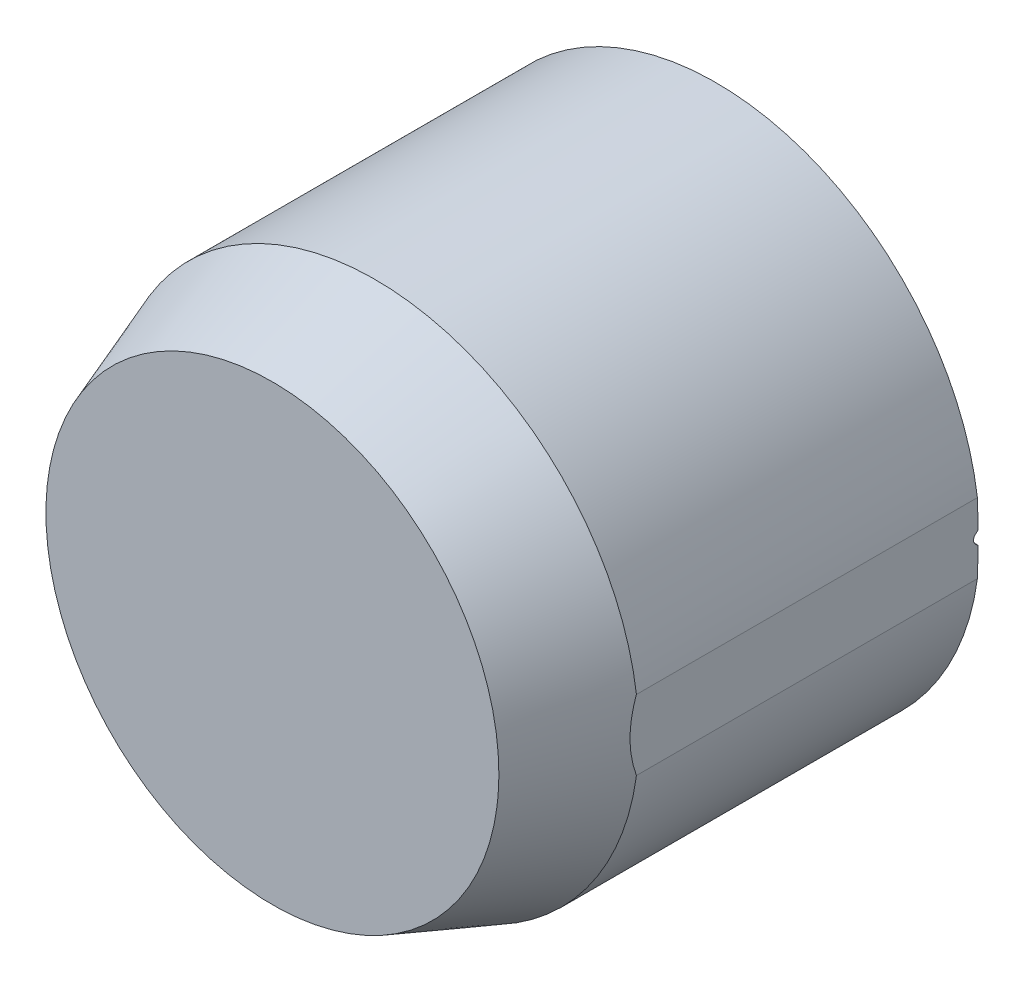
ISO-10303-21;
HEADER;
FILE_DESCRIPTION(('STEP AP214'),'2;1');
FILE_NAME('part.step','',(''),(''),'','','');
FILE_SCHEMA(('AUTOMOTIVE_DESIGN { 1 0 10303 214 1 1 1 1 }'));
ENDSEC;
DATA;
#1=APPLICATION_CONTEXT('core data for automotive mechanical design processes');
#2=APPLICATION_PROTOCOL_DEFINITION('international standard','automotive_design',2000,#1);
#3=PRODUCT_CONTEXT('',#1,'mechanical');
#4=PRODUCT('Part','Part','',(#3));
#5=PRODUCT_RELATED_PRODUCT_CATEGORY('part','',(#4));
#6=PRODUCT_DEFINITION_FORMATION('','',#4);
#7=PRODUCT_DEFINITION_CONTEXT('part definition',#1,'design');
#8=PRODUCT_DEFINITION('design','',#6,#7);
#9=PRODUCT_DEFINITION_SHAPE('','',#8);
#10=(LENGTH_UNIT() NAMED_UNIT(*) SI_UNIT(.MILLI.,.METRE.));
#11=(NAMED_UNIT(*) PLANE_ANGLE_UNIT() SI_UNIT($,.RADIAN.));
#12=(NAMED_UNIT(*) SI_UNIT($,.STERADIAN.) SOLID_ANGLE_UNIT());
#13=UNCERTAINTY_MEASURE_WITH_UNIT(LENGTH_MEASURE(1.E-05),#10,'distance_accuracy_value','');
#14=(GEOMETRIC_REPRESENTATION_CONTEXT(3) GLOBAL_UNCERTAINTY_ASSIGNED_CONTEXT((#13)) GLOBAL_UNIT_ASSIGNED_CONTEXT((#10,
#11,#12)) REPRESENTATION_CONTEXT('',''));
#15=CARTESIAN_POINT('',(0.,0.,0.));
#16=DIRECTION('',(0.,0.,1.));
#17=DIRECTION('',(1.,0.,0.));
#18=AXIS2_PLACEMENT_3D('',#15,#16,#17);
#19=CARTESIAN_POINT('',(0.,0.,-15.6));
#20=DIRECTION('',(0.,0.,1.));
#21=DIRECTION('',(1.,0.,0.));
#22=AXIS2_PLACEMENT_3D('',#19,#20,#21);
#23=CONICAL_SURFACE('',#22,7.25,1.30899693899575);
#24=CARTESIAN_POINT('',(0.,0.,-15.1310889132455));
#25=DIRECTION('',(0.,0.,1.));
#26=DIRECTION('',(1.,0.,0.));
#27=AXIS2_PLACEMENT_3D('',#24,#25,#26);
#28=CIRCLE('',#27,9.);
#29=CARTESIAN_POINT('',(-8.99769609071522,-0.20362971081845,-15.1310889132455));
#30=VERTEX_POINT('',#29);
#31=CARTESIAN_POINT('',(8.92,-1.19733036376764,-15.1310889132455));
#32=VERTEX_POINT('',#31);
#33=EDGE_CURVE('E136',#30,#32,#28,.T.);
#34=ORIENTED_EDGE('',*,*,#33,.F.);
#35=CARTESIAN_POINT('',(-8.99844651612489,-0.203460650926126,-15.1308889132455));
#36=CARTESIAN_POINT('',(-8.85072480750056,-0.23673977029043,-15.1702585341613));
#37=CARTESIAN_POINT('',(-8.70297930754743,-0.269974929463282,-15.2095761496122));
#38=CARTESIAN_POINT('',(-8.40743262424242,-0.336341395836442,-15.2880885223113));
#39=CARTESIAN_POINT('',(-8.25963144098153,-0.369472703205639,-15.3272832797594));
#40=CARTESIAN_POINT('',(-7.96396473964342,-0.435615658444923,-15.4055312359482));
#41=CARTESIAN_POINT('',(-7.81609922153576,-0.468627306258332,-15.4445844346218));
#42=CARTESIAN_POINT('',(-7.5202924882839,-0.534509446683646,-15.5225238435728));
#43=CARTESIAN_POINT('',(-7.37235127301666,-0.567379939065321,-15.5614100535778));
#44=CARTESIAN_POINT('',(-7.22436673413899,-0.600169059892325,-15.6002));
#45=B_SPLINE_CURVE_WITH_KNOTS('',3,(#35,#36,#37,#38,#39,#40,#41,#42,#43,#44),.UNSPECIFIED.,.F.,
.F.,(4,2,2,2,4),(0.,0.469374636792449,0.93874850986669,1.40812260524157,1.87749746589729),.UNSPECIFIED.);
#46=CARTESIAN_POINT('',(-7.22512975662029,-0.6,-15.6));
#47=VERTEX_POINT('',#46);
#48=EDGE_CURVE('E286',#30,#47,#45,.T.);
#49=ORIENTED_EDGE('',*,*,#48,.T.);
#50=CARTESIAN_POINT('',(0.,0.,-15.6));
#51=DIRECTION('',(0.,0.,1.));
#52=DIRECTION('',(1.,0.,0.));
#53=AXIS2_PLACEMENT_3D('',#50,#51,#52);
#54=CIRCLE('',#53,7.25);
#55=CARTESIAN_POINT('',(7.22512975662029,-0.6,-15.6));
#56=VERTEX_POINT('',#55);
#57=EDGE_CURVE('E258',#47,#56,#54,.T.);
#58=ORIENTED_EDGE('',*,*,#57,.T.);
#59=CARTESIAN_POINT('',(7.224366734139,-0.600169059892323,-15.6002));
#60=CARTESIAN_POINT('',(7.36581934105032,-0.568827332133396,-15.5631223379619));
#61=CARTESIAN_POINT('',(7.5072323041833,-0.537411136461317,-15.5259565794367));
#62=CARTESIAN_POINT('',(7.78998860975481,-0.474448882228076,-15.451471432939));
#63=CARTESIAN_POINT('',(7.93133195229936,-0.44290282386534,-15.4141520452013));
#64=CARTESIAN_POINT('',(8.21395905538082,-0.379699834796883,-15.3393821063358));
#65=CARTESIAN_POINT('',(8.35524281594311,-0.34804290413842,-15.3019315552639));
#66=CARTESIAN_POINT('',(8.637758486201,-0.284632311740158,-15.2269160190222));
#67=CARTESIAN_POINT('',(8.77899039581723,-0.25287864985295,-15.1893510336781));
#68=CARTESIAN_POINT('',(8.9202,-0.22108374796752,-15.1517372608922));
#69=B_SPLINE_CURVE_WITH_KNOTS('',3,(#59,#60,#61,#62,#63,#64,#65,#66,#67,#68),.UNSPECIFIED.,.F.,
.F.,(4,2,2,2,4),(0.,0.44865684471615,0.897313004149584,1.34596897236778,1.79462562463149),.UNSPECIFIED.);
#70=CARTESIAN_POINT('',(8.92,-0.221128780769889,-15.1517905352694));
#71=VERTEX_POINT('',#70);
#72=EDGE_CURVE('E277',#56,#71,#69,.T.);
#73=ORIENTED_EDGE('',*,*,#72,.T.);
#74=CARTESIAN_POINT('',(8.92,8.06040480600583,-14.3212568380107));
#75=CARTESIAN_POINT('',(8.92,7.68001067879733,-14.3895575898964));
#76=CARTESIAN_POINT('',(8.92,7.29914344334273,-14.4553511489225));
#77=CARTESIAN_POINT('',(8.92,6.53629412966904,-14.5806368351737));
#78=CARTESIAN_POINT('',(8.92,6.15431183094219,-14.6401276150436));
#79=CARTESIAN_POINT('',(8.92,5.38847485893661,-14.7515997766627));
#80=CARTESIAN_POINT('',(8.92,5.00461798190343,-14.8035661840258));
#81=CARTESIAN_POINT('',(8.92,4.23578260307555,-14.8983143973265));
#82=CARTESIAN_POINT('',(8.92,3.85080416657026,-14.9410967274811));
#83=CARTESIAN_POINT('',(8.92,3.08451626461631,-15.0154464975093));
#84=CARTESIAN_POINT('',(8.92,2.70321968305866,-15.0471450019416));
#85=CARTESIAN_POINT('',(8.92,1.93981340688746,-15.09866292791));
#86=CARTESIAN_POINT('',(8.92,1.55770371481237,-15.1184823864768));
#87=CARTESIAN_POINT('',(8.92,0.793424798447278,-15.1452333793678));
#88=CARTESIAN_POINT('',(8.92,0.411256052403924,-15.1521783413867));
#89=CARTESIAN_POINT('',(8.92,-0.353091510735589,-15.152845949497));
#90=CARTESIAN_POINT('',(8.92,-0.735270327792999,-15.1465686406375));
#91=CARTESIAN_POINT('',(8.92,-1.49792502250881,-15.1211741254303));
#92=CARTESIAN_POINT('',(8.92,-1.87840234172456,-15.1020996116964));
#93=CARTESIAN_POINT('',(8.92,-2.63856592942137,-15.0521078426765));
#94=CARTESIAN_POINT('',(8.92,-3.01825218510469,-15.0211903972695));
#95=CARTESIAN_POINT('',(8.92,-4.15662193407135,-14.9126290196026));
#96=CARTESIAN_POINT('',(8.92,-4.91381522725906,-14.8192079385958));
#97=CARTESIAN_POINT('',(8.92,-6.05102973635481,-14.6557694457604));
#98=CARTESIAN_POINT('',(8.92,-6.43277077834075,-14.5969554252784));
#99=CARTESIAN_POINT('',(8.92,-7.19523352466831,-14.4729344225565));
#100=CARTESIAN_POINT('',(8.92,-7.5759552034663,-14.4077272816272));
#101=CARTESIAN_POINT('',(8.92,-8.33554004831013,-14.2722539629486));
#102=CARTESIAN_POINT('',(8.92,-8.71440548210717,-14.2020003573709));
#103=CARTESIAN_POINT('',(8.92,-9.47127570759801,-14.0572100550187));
#104=CARTESIAN_POINT('',(8.92,-9.84928058914404,-13.9826738289398));
#105=CARTESIAN_POINT('',(8.92,-10.2269351605415,-13.9064455658812));
#106=B_SPLINE_CURVE_WITH_KNOTS('',3,(#74,#75,#76,#77,#78,#79,#80,#81,#82,#83,#84,#85,#86,#87,
#88,#89,#90,#91,#92,#93,#94,#95,#96,#97,#98,#99,#100,#101,#102,#103,#104,#105),.UNSPECIFIED.,
.F.,.F.,(4,2,2,2,2,2,2,2,2,2,2,2,2,2,2,4),(0.,1.15945730612509,2.31916197326693,
3.48114376936633,4.64305922318448,5.79072953488506,6.93839626891887,8.08486534777758,
9.23133052055896,10.3739898772458,11.516667578431,13.8044247564448,14.9631364664453,
16.1218769451531,17.2778246084184,18.4336454655662),.UNSPECIFIED.);
#107=EDGE_CURVE('E360',#71,#32,#106,.T.);
#108=ORIENTED_EDGE('',*,*,#107,.T.);
#109=EDGE_LOOP('',(#34,#49,#58,#73,#108));
#110=FACE_BOUND('',#109,.T.);
#111=ADVANCED_FACE('F113',(#110),#23,.T.);
#112=CARTESIAN_POINT('',(0.,7.25,-15.6));
#113=DIRECTION('',(0.,0.,1.));
#114=DIRECTION('',(1.,0.,0.));
#115=AXIS2_PLACEMENT_3D('',#112,#113,#114);
#116=PLANE('',#115);
#117=ORIENTED_EDGE('',*,*,#57,.F.);
#118=DIRECTION('',(1.,0.,0.));
#119=VECTOR('',#118,1.);
#120=CARTESIAN_POINT('',(-9.,-0.6,-15.6));
#121=LINE('',#120,#119);
#122=EDGE_CURVE('E205',#47,#56,#121,.T.);
#123=ORIENTED_EDGE('',*,*,#122,.T.);
#124=EDGE_LOOP('',(#117,#123));
#125=FACE_BOUND('',#124,.T.);
#126=ADVANCED_FACE('F302',(#125),#116,.F.);
#127=CARTESIAN_POINT('',(0.,0.,0.));
#128=DIRECTION('',(0.,0.,-1.));
#129=DIRECTION('',(-1.,0.,0.));
#130=AXIS2_PLACEMENT_3D('',#127,#128,#129);
#131=PLANE('',#130);
#132=CARTESIAN_POINT('',(0.,0.,0.));
#133=DIRECTION('',(0.,0.,1.));
#134=DIRECTION('',(1.,0.,0.));
#135=AXIS2_PLACEMENT_3D('',#132,#133,#134);
#136=CIRCLE('',#135,7.72610418006829);
#137=CARTESIAN_POINT('',(7.72610418006829,0.,0.));
#138=VERTEX_POINT('',#137);
#139=EDGE_CURVE('E356',#138,#138,#136,.T.);
#140=ORIENTED_EDGE('',*,*,#139,.T.);
#141=EDGE_LOOP('',(#140));
#142=FACE_BOUND('',#141,.T.);
#143=ADVANCED_FACE('F115',(#142),#131,.F.);
#144=CARTESIAN_POINT('',(0.,0.,-3.5));
#145=DIRECTION('',(0.,0.,-1.));
#146=DIRECTION('',(-1.,0.,0.));
#147=AXIS2_PLACEMENT_3D('',#144,#145,#146);
#148=CONICAL_SURFACE('',#147,9.,0.349065850398867);
#149=ORIENTED_EDGE('',*,*,#139,.F.);
#150=EDGE_LOOP('',(#149));
#151=FACE_BOUND('',#150,.T.);
#152=CARTESIAN_POINT('',(0.,0.,-3.5));
#153=DIRECTION('',(0.,0.,1.));
#154=DIRECTION('',(1.,0.,0.));
#155=AXIS2_PLACEMENT_3D('',#152,#153,#154);
#156=CIRCLE('',#155,9.);
#157=CARTESIAN_POINT('',(8.92,1.19733036376764,-3.5));
#158=VERTEX_POINT('',#157);
#159=CARTESIAN_POINT('',(8.92,-1.19733036376764,-3.5));
#160=VERTEX_POINT('',#159);
#161=EDGE_CURVE('E352',#158,#160,#156,.T.);
#162=ORIENTED_EDGE('',*,*,#161,.T.);
#163=CARTESIAN_POINT('',(8.92,-5.80700087009971,-8.01593950329092));
#164=CARTESIAN_POINT('',(8.92,-5.72785371191214,-7.89730604705527));
#165=CARTESIAN_POINT('',(8.92,-5.64792687720362,-7.7791937153204));
#166=CARTESIAN_POINT('',(8.92,-5.48634760740595,-7.54414528535312));
#167=CARTESIAN_POINT('',(8.92,-5.40469506666294,-7.42720925978904));
#168=CARTESIAN_POINT('',(8.92,-5.15663302604553,-7.0779925943142));
#169=CARTESIAN_POINT('',(8.92,-4.98738744900168,-6.84770821405169));
#170=CARTESIAN_POINT('',(8.92,-4.635230861794,-6.38821610295551));
#171=CARTESIAN_POINT('',(8.92,-4.45207889663195,-6.15919220839342));
#172=CARTESIAN_POINT('',(8.92,-4.07398456416996,-5.71123967989708));
#173=CARTESIAN_POINT('',(8.92,-3.87905090917198,-5.49230379223091));
#174=CARTESIAN_POINT('',(8.92,-3.54845931314383,-5.14619252255328));
#175=CARTESIAN_POINT('',(8.92,-3.41724464897646,-5.01478164495403));
#176=CARTESIAN_POINT('',(8.92,-3.14793462856623,-4.75923681308715));
#177=CARTESIAN_POINT('',(8.92,-3.00984145530626,-4.63510057699847));
#178=CARTESIAN_POINT('',(8.92,-2.72676126929525,-4.39705113909831));
#179=CARTESIAN_POINT('',(8.92,-2.58183183849729,-4.28307002073053));
#180=CARTESIAN_POINT('',(8.92,-2.2832636803394,-4.06725436979977));
#181=CARTESIAN_POINT('',(8.92,-2.12963265509625,-3.96540933553875));
#182=CARTESIAN_POINT('',(8.92,-1.83245780604371,-3.78922740350414));
#183=CARTESIAN_POINT('',(8.92,-1.69001708060359,-3.71304614452305));
#184=CARTESIAN_POINT('',(8.92,-1.39750593334516,-3.57599845101395));
#185=CARTESIAN_POINT('',(8.92,-1.24742337360193,-3.51515735580064));
#186=CARTESIAN_POINT('',(8.92,-0.987623692752254,-3.42824964336367));
#187=CARTESIAN_POINT('',(8.92,-0.879557090136777,-3.39723657824054));
#188=CARTESIAN_POINT('',(8.92,-0.660988068073328,-3.34557793230264));
#189=CARTESIAN_POINT('',(8.92,-0.550486745521225,-3.32492777858053));
#190=CARTESIAN_POINT('',(8.92,-0.328109222279753,-3.29488105020745));
#191=CARTESIAN_POINT('',(8.92,-0.216235205172631,-3.28546848117775));
#192=CARTESIAN_POINT('',(8.92,0.00788450792994269,-3.27827773159247));
#193=CARTESIAN_POINT('',(8.92,0.120130185497724,-3.28049898259212));
#194=CARTESIAN_POINT('',(8.92,0.34363293603442,-3.2964634081789));
#195=CARTESIAN_POINT('',(8.92,0.454891194956007,-3.31019007113337));
#196=CARTESIAN_POINT('',(8.92,0.675541375127132,-3.34851575905727));
#197=CARTESIAN_POINT('',(8.92,0.784932147954836,-3.37312124041566));
#198=CARTESIAN_POINT('',(8.92,1.10926220825863,-3.46191619680086));
#199=CARTESIAN_POINT('',(8.92,1.3202034506579,-3.54107091038412));
#200=CARTESIAN_POINT('',(8.92,1.66778975142845,-3.70181944945335));
#201=CARTESIAN_POINT('',(8.92,1.80810662759776,-3.77591527967901));
#202=CARTESIAN_POINT('',(8.92,2.08180183508883,-3.93612578165416));
#203=CARTESIAN_POINT('',(8.92,2.21517625933685,-4.02224712284273));
#204=CARTESIAN_POINT('',(8.92,2.47636842925514,-4.20471212841463));
#205=CARTESIAN_POINT('',(8.92,2.60412836780536,-4.30113750807644));
#206=CARTESIAN_POINT('',(8.92,2.85345723327453,-4.50153937353177));
#207=CARTESIAN_POINT('',(8.92,2.97502840466745,-4.60551308810603));
#208=CARTESIAN_POINT('',(8.92,3.27801812202553,-4.87828760847121));
#209=CARTESIAN_POINT('',(8.92,3.4556191076034,-5.05131919748291));
#210=CARTESIAN_POINT('',(8.92,3.8000574321826,-5.40785196028196));
#211=CARTESIAN_POINT('',(8.92,3.96688784176511,-5.59135973383356));
#212=CARTESIAN_POINT('',(8.92,4.29212470417051,-5.96674772592546));
#213=CARTESIAN_POINT('',(8.92,4.45050047600103,-6.15865437210896));
#214=CARTESIAN_POINT('',(8.92,4.75974859966809,-6.54842817800186));
#215=CARTESIAN_POINT('',(8.92,4.91061994360137,-6.74629613266188));
#216=CARTESIAN_POINT('',(8.92,5.1968992506203,-7.13428934480644));
#217=CARTESIAN_POINT('',(8.92,5.33268638398466,-7.32413607266626));
#218=CARTESIAN_POINT('',(8.92,5.59950203674333,-7.70716158890105));
#219=CARTESIAN_POINT('',(8.92,5.73053012410055,-7.90034067745904));
#220=CARTESIAN_POINT('',(8.92,5.98736766571061,-8.287763940409));
#221=CARTESIAN_POINT('',(8.92,6.11321207291007,-8.48198501502581));
#222=CARTESIAN_POINT('',(8.92,6.36131830029271,-8.87263559304933));
#223=CARTESIAN_POINT('',(8.92,6.48358101706732,-9.06906452643738));
#224=CARTESIAN_POINT('',(8.92,6.60431810743963,-9.26641256703042));
#225=B_SPLINE_CURVE_WITH_KNOTS('',3,(#163,#164,#165,#166,#167,#168,#169,#170,#171,#172,#173,
#174,#175,#176,#177,#178,#179,#180,#181,#182,#183,#184,#185,#186,#187,#188,#189,#190,#191,#192,
#193,#194,#195,#196,#197,#198,#199,#200,#201,#202,#203,#204,#205,#206,#207,#208,#209,#210,#211,
#212,#213,#214,#215,#216,#217,#218,#219,#220,#221,#222,#223,#224),.UNSPECIFIED.,.F.,.F.,(4,2,2,
2,2,2,2,2,2,2,2,2,2,2,2,2,2,2,2,2,2,2,2,2,2,2,2,2,2,2,4),(0.,0.427829462169573,
0.855685193900475,1.71285317176254,2.59231875461591,3.47114176549154,4.0280454560257,
4.58477351834974,5.13744384404343,5.6896324010474,6.17351383211167,6.65818939158962,
6.99503372451875,7.33172928502989,7.66794505553247,8.00414439821395,8.33986207937371,
8.67577927113027,9.34807519952933,9.8235539666012,10.2992974929879,10.7791418222419,
11.2588108685935,12.0020271438765,12.7457169095345,13.4919438534132,14.238270752262,
14.9384156230026,15.6386238964332,16.3328660262949,17.0269328577353),.UNSPECIFIED.);
#226=EDGE_CURVE('E249',#160,#158,#225,.T.);
#227=ORIENTED_EDGE('',*,*,#226,.T.);
#228=EDGE_LOOP('',(#162,#227));
#229=FACE_BOUND('',#228,.T.);
#230=ADVANCED_FACE('F263',(#151,#229),#148,.T.);
#231=CARTESIAN_POINT('',(0.,0.,0.));
#232=DIRECTION('',(0.,0.,1.));
#233=DIRECTION('',(1.,0.,0.));
#234=AXIS2_PLACEMENT_3D('',#231,#232,#233);
#235=CYLINDRICAL_SURFACE('',#234,9.);
#236=CARTESIAN_POINT('',(0.,0.,-14.8901923788647));
#237=DIRECTION('',(0.,0.763707940790425,0.645561911185635));
#238=DIRECTION('',(0.,-0.645561911185635,0.763707940790425));
#239=AXIS2_PLACEMENT_3D('',#236,#237,#238);
#240=ELLIPSE('',#239,13.9413429510899,9.);
#241=CARTESIAN_POINT('',(-8.99769609071522,0.203629710818451,-15.1310889132455));
#242=VERTEX_POINT('',#241);
#243=CARTESIAN_POINT('',(-8.99870379595011,0.152741588158086,-15.0708876177629));
#244=VERTEX_POINT('',#243);
#245=EDGE_CURVE('E278',#242,#244,#240,.T.);
#246=ORIENTED_EDGE('',*,*,#245,.T.);
#247=CARTESIAN_POINT('',(-8.99870379595011,0.152741588158086,-15.0708876177629));
#248=CARTESIAN_POINT('',(-8.99882720321857,0.145485461531001,-15.0622887523864));
#249=CARTESIAN_POINT('',(-8.99895389968085,0.13749196211843,-15.0543169500295));
#250=CARTESIAN_POINT('',(-8.99920012074614,0.120290632026133,-15.0398266527664));
#251=CARTESIAN_POINT('',(-8.99931965043748,0.111083678100248,-15.033307117621));
#252=CARTESIAN_POINT('',(-8.9995380543543,0.0917002532389276,-15.021905009235));
#253=CARTESIAN_POINT('',(-8.99963691908881,0.0815233399324713,-15.017023187541));
#254=CARTESIAN_POINT('',(-8.99980280562127,0.0604963661746346,-15.0090377758399));
#255=CARTESIAN_POINT('',(-8.9998698333101,0.0496464306744403,-15.0059338568415));
#256=CARTESIAN_POINT('',(-8.99996450116338,0.0275800642404054,-15.0015918529418));
#257=CARTESIAN_POINT('',(-8.99999214440573,0.016363662016125,-15.000353622236));
#258=CARTESIAN_POINT('',(-9.00000493994797,-0.00611850426040393,-14.9997776033616));
#259=CARTESIAN_POINT('',(-8.99999008981978,-0.0173842710966308,-15.0004399237909));
#260=CARTESIAN_POINT('',(-8.99991958305582,-0.0396400070514985,-15.0036456514758));
#261=CARTESIAN_POINT('',(-8.99986394293902,-0.0506300859544705,-15.0061882972474));
#262=CARTESIAN_POINT('',(-8.99971810550823,-0.0720323830461386,-15.0130835599897));
#263=CARTESIAN_POINT('',(-8.99962789336384,-0.0824443510446233,-15.0174369537869));
#264=CARTESIAN_POINT('',(-8.9994230046089,-0.102398210604272,-15.027833250852));
#265=CARTESIAN_POINT('',(-8.99930830432653,-0.111939247435225,-15.0338777906598));
#266=CARTESIAN_POINT('',(-8.99906761817365,-0.129854368864099,-15.0474753063641));
#267=CARTESIAN_POINT('',(-8.99894165704107,-0.138230912924637,-15.0550250185154));
#268=CARTESIAN_POINT('',(-8.99877918364728,-0.148252382867835,-15.0657125752834));
#269=CARTESIAN_POINT('',(-8.99874131710102,-0.150531406258355,-15.0682720773672));
#270=CARTESIAN_POINT('',(-8.99870379595011,-0.152741588158086,-15.0708876177629));
#271=B_SPLINE_CURVE_WITH_KNOTS('',3,(#247,#248,#249,#250,#251,#252,#253,#254,#255,#256,#257,
#258,#259,#260,#261,#262,#263,#264,#265,#266,#267,#268,#269,#270),.UNSPECIFIED.,.F.,.F.,(4,2,2,
2,2,2,2,2,2,2,2,4),(0.,0.0337111306724844,0.0673980363158108,0.101100379798528,
0.134796484829687,0.168489956356777,0.202185353174269,0.235867111679856,0.269563334877255,
0.303292279724992,0.336948868538669,0.347225804841242),.UNSPECIFIED.);
#272=CARTESIAN_POINT('',(-8.99870379595011,-0.152741588158084,-15.0708876177629));
#273=VERTEX_POINT('',#272);
#274=EDGE_CURVE('E191',#244,#273,#271,.T.);
#275=ORIENTED_EDGE('',*,*,#274,.T.);
#276=CARTESIAN_POINT('',(0.,0.,-14.8901923788647));
#277=DIRECTION('',(0.,-0.763707940790424,0.645561911185635));
#278=DIRECTION('',(0.,0.645561911185635,0.763707940790424));
#279=AXIS2_PLACEMENT_3D('',#276,#277,#278);
#280=ELLIPSE('',#279,13.9413429510899,9.);
#281=EDGE_CURVE('E331',#273,#30,#280,.T.);
#282=ORIENTED_EDGE('',*,*,#281,.T.);
#283=ORIENTED_EDGE('',*,*,#33,.T.);
#284=DIRECTION('',(0.,0.,1.));
#285=VECTOR('',#284,1.);
#286=CARTESIAN_POINT('',(8.92,-1.19733036376764,0.));
#287=LINE('',#286,#285);
#288=EDGE_CURVE('E259',#32,#160,#287,.T.);
#289=ORIENTED_EDGE('',*,*,#288,.T.);
#290=ORIENTED_EDGE('',*,*,#161,.F.);
#291=DIRECTION('',(0.,0.,1.));
#292=VECTOR('',#291,1.);
#293=CARTESIAN_POINT('',(8.92,1.19733036376764,0.));
#294=LINE('',#293,#292);
#295=CARTESIAN_POINT('',(8.92,1.19733036376764,-15.1310889132455));
#296=VERTEX_POINT('',#295);
#297=EDGE_CURVE('E332',#158,#296,#294,.F.);
#298=ORIENTED_EDGE('',*,*,#297,.T.);
#299=EDGE_CURVE('E324',#296,#242,#28,.T.);
#300=ORIENTED_EDGE('',*,*,#299,.T.);
#301=EDGE_LOOP('',(#246,#275,#282,#283,#289,#290,#298,#300));
#302=FACE_BOUND('',#301,.T.);
#303=ADVANCED_FACE('F266',(#302),#235,.T.);
#304=CARTESIAN_POINT('',(7.22512975662029,0.6,-15.6));
#305=VERTEX_POINT('',#304);
#306=CARTESIAN_POINT('',(-7.22512975662029,0.6,-15.6));
#307=VERTEX_POINT('',#306);
#308=EDGE_CURVE('E261',#305,#307,#54,.T.);
#309=ORIENTED_EDGE('',*,*,#308,.T.);
#310=CARTESIAN_POINT('',(-7.22436673413899,0.600169059892325,-15.6002));
#311=CARTESIAN_POINT('',(-7.37235127301667,0.567379939065321,-15.5614100535778));
#312=CARTESIAN_POINT('',(-7.5202924882839,0.534509446683647,-15.5225238435728));
#313=CARTESIAN_POINT('',(-7.81609922153576,0.468627306258333,-15.4445844346218));
#314=CARTESIAN_POINT('',(-7.96396473964342,0.435615658444924,-15.4055312359482));
#315=CARTESIAN_POINT('',(-8.25963144098153,0.36947270320564,-15.3272832797594));
#316=CARTESIAN_POINT('',(-8.40743262424242,0.336341395836444,-15.2880885223113));
#317=CARTESIAN_POINT('',(-8.70297930754743,0.269974929463284,-15.2095761496122));
#318=CARTESIAN_POINT('',(-8.85072480750055,0.236739770290432,-15.1702585341613));
#319=CARTESIAN_POINT('',(-8.99844651612489,0.203460650926128,-15.1308889132455));
#320=B_SPLINE_CURVE_WITH_KNOTS('',3,(#310,#311,#312,#313,#314,#315,#316,#317,#318,#319),
.UNSPECIFIED.,.F.,.F.,(4,2,2,2,4),(0.,0.469374860655724,0.938748956030603,1.40812282910484,
1.87749746589729),.UNSPECIFIED.);
#321=EDGE_CURVE('E221',#307,#242,#320,.T.);
#322=ORIENTED_EDGE('',*,*,#321,.T.);
#323=ORIENTED_EDGE('',*,*,#299,.F.);
#324=CARTESIAN_POINT('',(8.92,0.221128780769889,-15.1517905352694));
#325=VERTEX_POINT('',#324);
#326=EDGE_CURVE('E122',#296,#325,#106,.T.);
#327=ORIENTED_EDGE('',*,*,#326,.T.);
#328=CARTESIAN_POINT('',(8.9202,0.221083747967522,-15.1517372608922));
#329=CARTESIAN_POINT('',(8.77899039581723,0.252878649852951,-15.1893510336781));
#330=CARTESIAN_POINT('',(8.637758486201,0.284632311740159,-15.2269160190222));
#331=CARTESIAN_POINT('',(8.35524281594311,0.348042904138422,-15.3019315552639));
#332=CARTESIAN_POINT('',(8.21395905538082,0.379699834796884,-15.3393821063358));
#333=CARTESIAN_POINT('',(7.93133195229936,0.442902823865341,-15.4141520452013));
#334=CARTESIAN_POINT('',(7.78998860975481,0.474448882228077,-15.451471432939));
#335=CARTESIAN_POINT('',(7.5072323041833,0.537411136461318,-15.5259565794367));
#336=CARTESIAN_POINT('',(7.36581934105032,0.568827332133397,-15.5631223379619));
#337=CARTESIAN_POINT('',(7.224366734139,0.600169059892325,-15.6002));
#338=B_SPLINE_CURVE_WITH_KNOTS('',3,(#328,#329,#330,#331,#332,#333,#334,#335,#336,#337),
.UNSPECIFIED.,.F.,.F.,(4,2,2,2,4),(0.,0.448656652263713,0.897312620481905,1.34596877991534,
1.79462562463149),.UNSPECIFIED.);
#339=EDGE_CURVE('E129',#325,#305,#338,.T.);
#340=ORIENTED_EDGE('',*,*,#339,.T.);
#341=EDGE_LOOP('',(#309,#322,#323,#327,#340));
#342=FACE_BOUND('',#341,.T.);
#343=ADVANCED_FACE('F227',(#342),#23,.T.);
#344=ORIENTED_EDGE('',*,*,#308,.F.);
#345=DIRECTION('',(1.,0.,0.));
#346=VECTOR('',#345,1.);
#347=CARTESIAN_POINT('',(-9.,0.6,-15.6));
#348=LINE('',#347,#346);
#349=EDGE_CURVE('E194',#307,#305,#348,.T.);
#350=ORIENTED_EDGE('',*,*,#349,.F.);
#351=EDGE_LOOP('',(#344,#350));
#352=FACE_BOUND('',#351,.T.);
#353=ADVANCED_FACE('F241',(#352),#116,.F.);
#354=CARTESIAN_POINT('',(8.92,10.6683533628506,-15.6));
#355=DIRECTION('',(-1.,0.,0.));
#356=DIRECTION('',(0.,-1.,0.));
#357=AXIS2_PLACEMENT_3D('',#354,#355,#356);
#358=PLANE('',#357);
#359=ORIENTED_EDGE('',*,*,#107,.F.);
#360=DIRECTION('',(0.,-0.645561911185635,-0.763707940790424));
#361=VECTOR('',#360,1.);
#362=CARTESIAN_POINT('',(8.92,-0.152741588158084,-15.0708876177629));
#363=LINE('',#362,#361);
#364=CARTESIAN_POINT('',(8.92,-0.152741588158084,-15.0708876177629));
#365=VERTEX_POINT('',#364);
#366=EDGE_CURVE('E198',#365,#71,#363,.T.);
#367=ORIENTED_EDGE('',*,*,#366,.F.);
#368=CARTESIAN_POINT('',(8.92,0.,-15.2));
#369=DIRECTION('',(1.,0.,0.));
#370=DIRECTION('',(0.,0.,1.));
#371=AXIS2_PLACEMENT_3D('',#368,#369,#370);
#372=CIRCLE('',#371,0.200000000000001);
#373=CARTESIAN_POINT('',(8.92,0.152741588158086,-15.0708876177629));
#374=VERTEX_POINT('',#373);
#375=EDGE_CURVE('E189',#374,#365,#372,.T.);
#376=ORIENTED_EDGE('',*,*,#375,.F.);
#377=DIRECTION('',(0.,0.645561911185635,-0.763707940790425));
#378=VECTOR('',#377,1.);
#379=CARTESIAN_POINT('',(8.92,4.7959880880883,-20.5639072051969));
#380=LINE('',#379,#378);
#381=EDGE_CURVE('E12',#374,#325,#380,.T.);
#382=ORIENTED_EDGE('',*,*,#381,.T.);
#383=ORIENTED_EDGE('',*,*,#326,.F.);
#384=ORIENTED_EDGE('',*,*,#297,.F.);
#385=ORIENTED_EDGE('',*,*,#226,.F.);
#386=ORIENTED_EDGE('',*,*,#288,.F.);
#387=EDGE_LOOP('',(#359,#367,#376,#382,#383,#384,#385,#386));
#388=FACE_BOUND('',#387,.T.);
#389=ADVANCED_FACE('F197',(#388),#358,.F.);
#390=CARTESIAN_POINT('',(-9.,-0.152741588158084,-15.0708876177629));
#391=DIRECTION('',(0.,-0.763707940790424,0.645561911185635));
#392=DIRECTION('',(0.,-0.645561911185635,-0.763707940790424));
#393=AXIS2_PLACEMENT_3D('',#390,#391,#392);
#394=PLANE('',#393);
#395=DIRECTION('',(1.,0.,0.));
#396=VECTOR('',#395,1.);
#397=CARTESIAN_POINT('',(-9.,-0.152741588158084,-15.0708876177629));
#398=LINE('',#397,#396);
#399=EDGE_CURVE('E193',#273,#365,#398,.T.);
#400=ORIENTED_EDGE('',*,*,#399,.T.);
#401=ORIENTED_EDGE('',*,*,#366,.T.);
#402=ORIENTED_EDGE('',*,*,#72,.F.);
#403=ORIENTED_EDGE('',*,*,#122,.F.);
#404=ORIENTED_EDGE('',*,*,#48,.F.);
#405=ORIENTED_EDGE('',*,*,#281,.F.);
#406=EDGE_LOOP('',(#400,#401,#402,#403,#404,#405));
#407=FACE_BOUND('',#406,.T.);
#408=ADVANCED_FACE('F240',(#407),#394,.F.);
#409=CARTESIAN_POINT('',(-9.,0.,-15.2));
#410=DIRECTION('',(1.,0.,0.));
#411=DIRECTION('',(0.,0.,-1.));
#412=AXIS2_PLACEMENT_3D('',#409,#410,#411);
#413=CYLINDRICAL_SURFACE('',#412,0.200000000000001);
#414=DIRECTION('',(1.,0.,0.));
#415=VECTOR('',#414,1.);
#416=CARTESIAN_POINT('',(-9.,0.152741588158086,-15.0708876177629));
#417=LINE('',#416,#415);
#418=EDGE_CURVE('E180',#244,#374,#417,.T.);
#419=ORIENTED_EDGE('',*,*,#418,.T.);
#420=ORIENTED_EDGE('',*,*,#375,.T.);
#421=ORIENTED_EDGE('',*,*,#399,.F.);
#422=ORIENTED_EDGE('',*,*,#274,.F.);
#423=EDGE_LOOP('',(#419,#420,#421,#422));
#424=FACE_BOUND('',#423,.T.);
#425=ADVANCED_FACE('F187',(#424),#413,.F.);
#426=CARTESIAN_POINT('',(-9.,0.152741588158086,-15.0708876177629));
#427=DIRECTION('',(0.,0.763707940790425,0.645561911185635));
#428=DIRECTION('',(0.,-0.645561911185635,0.763707940790425));
#429=AXIS2_PLACEMENT_3D('',#426,#427,#428);
#430=PLANE('',#429);
#431=ORIENTED_EDGE('',*,*,#321,.F.);
#432=ORIENTED_EDGE('',*,*,#349,.T.);
#433=ORIENTED_EDGE('',*,*,#339,.F.);
#434=ORIENTED_EDGE('',*,*,#381,.F.);
#435=ORIENTED_EDGE('',*,*,#418,.F.);
#436=ORIENTED_EDGE('',*,*,#245,.F.);
#437=EDGE_LOOP('',(#431,#432,#433,#434,#435,#436));
#438=FACE_BOUND('',#437,.T.);
#439=ADVANCED_FACE('F179',(#438),#430,.F.);
#440=CLOSED_SHELL('',(#111,#126,#143,#230,#303,#343,#353,#389,#408,#425,#439));
#441=MANIFOLD_SOLID_BREP('B2',#440);
#442=ADVANCED_BREP_SHAPE_REPRESENTATION('',(#18,#441),#14);
#443=SHAPE_DEFINITION_REPRESENTATION(#9,#442);
ENDSEC;
END-ISO-10303-21;
